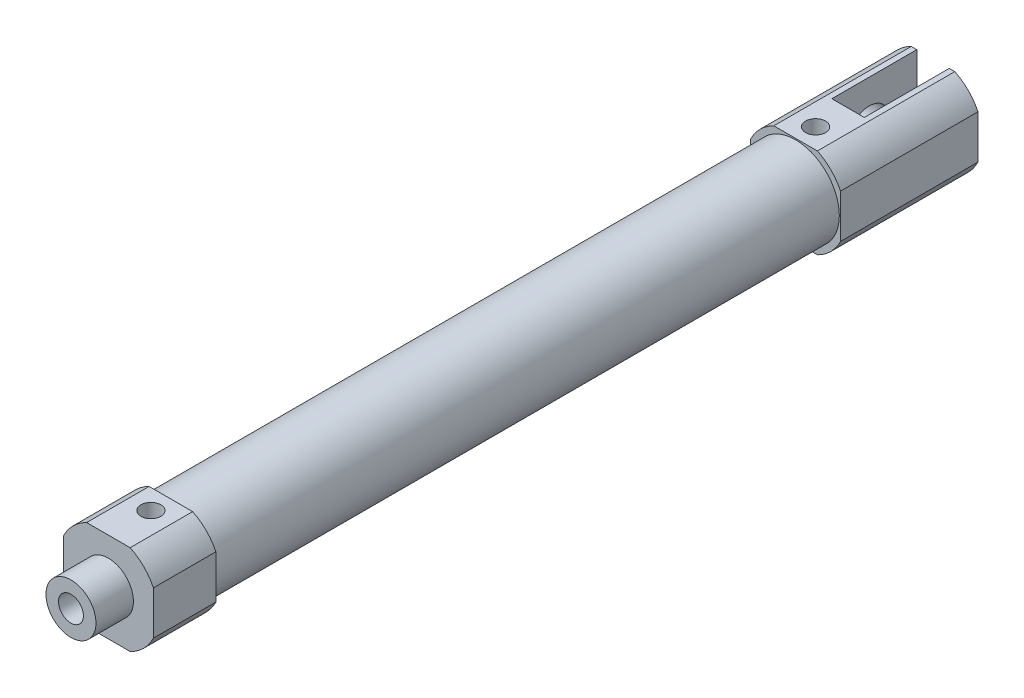
ISO-10303-21;
HEADER;
FILE_DESCRIPTION(('STEP AP214'),'2;1');
FILE_NAME('part.step','',(''),(''),'','','');
FILE_SCHEMA(('AUTOMOTIVE_DESIGN { 1 0 10303 214 1 1 1 1 }'));
ENDSEC;
DATA;
#1=APPLICATION_CONTEXT('core data for automotive mechanical design processes');
#2=APPLICATION_PROTOCOL_DEFINITION('international standard','automotive_design',2000,#1);
#3=PRODUCT_CONTEXT('',#1,'mechanical');
#4=PRODUCT('Part','Part','',(#3));
#5=PRODUCT_RELATED_PRODUCT_CATEGORY('part','',(#4));
#6=PRODUCT_DEFINITION_FORMATION('','',#4);
#7=PRODUCT_DEFINITION_CONTEXT('part definition',#1,'design');
#8=PRODUCT_DEFINITION('design','',#6,#7);
#9=PRODUCT_DEFINITION_SHAPE('','',#8);
#10=(LENGTH_UNIT() NAMED_UNIT(*) SI_UNIT(.MILLI.,.METRE.));
#11=(NAMED_UNIT(*) PLANE_ANGLE_UNIT() SI_UNIT($,.RADIAN.));
#12=(NAMED_UNIT(*) SI_UNIT($,.STERADIAN.) SOLID_ANGLE_UNIT());
#13=UNCERTAINTY_MEASURE_WITH_UNIT(LENGTH_MEASURE(1.E-05),#10,'distance_accuracy_value','');
#14=(GEOMETRIC_REPRESENTATION_CONTEXT(3) GLOBAL_UNCERTAINTY_ASSIGNED_CONTEXT((#13)) GLOBAL_UNIT_ASSIGNED_CONTEXT((#10,
#11,#12)) REPRESENTATION_CONTEXT('',''));
#15=CARTESIAN_POINT('',(0.,0.,0.));
#16=DIRECTION('',(0.,0.,1.));
#17=DIRECTION('',(1.,0.,0.));
#18=AXIS2_PLACEMENT_3D('',#15,#16,#17);
#19=CARTESIAN_POINT('',(0.,0.,-152.5));
#20=DIRECTION('',(0.,0.,-1.));
#21=DIRECTION('',(-1.,0.,0.));
#22=AXIS2_PLACEMENT_3D('',#19,#20,#21);
#23=PLANE('',#22);
#24=DIRECTION('',(0.,1.,0.));
#25=VECTOR('',#24,1.);
#26=CARTESIAN_POINT('',(-3.25,-9.,-152.5));
#27=LINE('',#26,#25);
#28=CARTESIAN_POINT('',(-3.25,-9.,-152.5));
#29=VERTEX_POINT('',#28);
#30=CARTESIAN_POINT('',(-3.25,9.,-152.5));
#31=VERTEX_POINT('',#30);
#32=EDGE_CURVE('E289',#29,#31,#27,.T.);
#33=ORIENTED_EDGE('',*,*,#32,.F.);
#34=DIRECTION('',(-1.,0.,0.));
#35=VECTOR('',#34,1.);
#36=CARTESIAN_POINT('',(4.35889894354067,-9.,-152.5));
#37=LINE('',#36,#35);
#38=CARTESIAN_POINT('',(-4.35889894354067,-9.,-152.5));
#39=VERTEX_POINT('',#38);
#40=EDGE_CURVE('E254',#29,#39,#37,.T.);
#41=ORIENTED_EDGE('',*,*,#40,.T.);
#42=CARTESIAN_POINT('',(0.,0.,-152.5));
#43=DIRECTION('',(0.,0.,-1.));
#44=DIRECTION('',(-1.,0.,0.));
#45=AXIS2_PLACEMENT_3D('',#42,#43,#44);
#46=CIRCLE('',#45,10.);
#47=CARTESIAN_POINT('',(-9.,-4.35889894354067,-152.5));
#48=VERTEX_POINT('',#47);
#49=EDGE_CURVE('E229',#39,#48,#46,.T.);
#50=ORIENTED_EDGE('',*,*,#49,.T.);
#51=DIRECTION('',(0.,1.,0.));
#52=VECTOR('',#51,1.);
#53=CARTESIAN_POINT('',(-9.,-4.35889894354067,-152.5));
#54=LINE('',#53,#52);
#55=CARTESIAN_POINT('',(-9.,4.35889894354067,-152.5));
#56=VERTEX_POINT('',#55);
#57=EDGE_CURVE('E271',#48,#56,#54,.T.);
#58=ORIENTED_EDGE('',*,*,#57,.T.);
#59=CARTESIAN_POINT('',(0.,0.,-152.5));
#60=DIRECTION('',(0.,0.,-1.));
#61=DIRECTION('',(-1.,0.,0.));
#62=AXIS2_PLACEMENT_3D('',#59,#60,#61);
#63=CIRCLE('',#62,10.);
#64=CARTESIAN_POINT('',(-4.35889894354068,9.,-152.5));
#65=VERTEX_POINT('',#64);
#66=EDGE_CURVE('E268',#56,#65,#63,.T.);
#67=ORIENTED_EDGE('',*,*,#66,.T.);
#68=DIRECTION('',(1.,0.,0.));
#69=VECTOR('',#68,1.);
#70=CARTESIAN_POINT('',(4.35889894354067,9.,-152.5));
#71=LINE('',#70,#69);
#72=EDGE_CURVE('E264',#65,#31,#71,.T.);
#73=ORIENTED_EDGE('',*,*,#72,.T.);
#74=EDGE_LOOP('',(#33,#41,#50,#58,#67,#73));
#75=FACE_BOUND('',#74,.T.);
#76=ADVANCED_FACE('F36',(#75),#23,.T.);
#77=CARTESIAN_POINT('',(0.,-22.1414213562373,0.));
#78=DIRECTION('',(0.,0.,1.));
#79=DIRECTION('',(1.,0.,0.));
#80=AXIS2_PLACEMENT_3D('',#77,#78,#79);
#81=PLANE('',#80);
#82=DIRECTION('',(0.,1.,0.));
#83=VECTOR('',#82,1.);
#84=CARTESIAN_POINT('',(9.00000000000001,-22.1414213562373,0.));
#85=LINE('',#84,#83);
#86=CARTESIAN_POINT('',(9.,-4.35889894354067,0.));
#87=VERTEX_POINT('',#86);
#88=CARTESIAN_POINT('',(9.,4.35889894354068,0.));
#89=VERTEX_POINT('',#88);
#90=EDGE_CURVE('E148',#87,#89,#85,.T.);
#91=ORIENTED_EDGE('',*,*,#90,.F.);
#92=CARTESIAN_POINT('',(0.,0.,0.));
#93=DIRECTION('',(0.,0.,1.));
#94=DIRECTION('',(1.,0.,0.));
#95=AXIS2_PLACEMENT_3D('',#92,#93,#94);
#96=CIRCLE('',#95,10.);
#97=CARTESIAN_POINT('',(4.35889894354068,-9.,0.));
#98=VERTEX_POINT('',#97);
#99=EDGE_CURVE('E94',#98,#87,#96,.T.);
#100=ORIENTED_EDGE('',*,*,#99,.F.);
#101=DIRECTION('',(1.,0.,0.));
#102=VECTOR('',#101,1.);
#103=CARTESIAN_POINT('',(0.,-9.,0.));
#104=LINE('',#103,#102);
#105=CARTESIAN_POINT('',(-4.35889894354068,-9.,0.));
#106=VERTEX_POINT('',#105);
#107=EDGE_CURVE('E162',#106,#98,#104,.T.);
#108=ORIENTED_EDGE('',*,*,#107,.F.);
#109=CARTESIAN_POINT('',(-9.,-4.35889894354068,0.));
#110=VERTEX_POINT('',#109);
#111=EDGE_CURVE('E136',#110,#106,#96,.T.);
#112=ORIENTED_EDGE('',*,*,#111,.F.);
#113=DIRECTION('',(0.,1.,0.));
#114=VECTOR('',#113,1.);
#115=CARTESIAN_POINT('',(-8.99999999999999,-22.1414213562373,0.));
#116=LINE('',#115,#114);
#117=CARTESIAN_POINT('',(-9.,4.35889894354067,0.));
#118=VERTEX_POINT('',#117);
#119=EDGE_CURVE('E159',#110,#118,#116,.T.);
#120=ORIENTED_EDGE('',*,*,#119,.T.);
#121=CARTESIAN_POINT('',(-4.35889894354067,9.,0.));
#122=VERTEX_POINT('',#121);
#123=EDGE_CURVE('E156',#122,#118,#96,.T.);
#124=ORIENTED_EDGE('',*,*,#123,.F.);
#125=DIRECTION('',(1.,0.,0.));
#126=VECTOR('',#125,1.);
#127=CARTESIAN_POINT('',(0.,8.99999999999999,0.));
#128=LINE('',#127,#126);
#129=CARTESIAN_POINT('',(4.35889894354068,8.99999999999999,0.));
#130=VERTEX_POINT('',#129);
#131=EDGE_CURVE('E155',#122,#130,#128,.T.);
#132=ORIENTED_EDGE('',*,*,#131,.T.);
#133=EDGE_CURVE('E151',#89,#130,#96,.T.);
#134=ORIENTED_EDGE('',*,*,#133,.F.);
#135=EDGE_LOOP('',(#91,#100,#108,#112,#120,#124,#132,#134));
#136=FACE_BOUND('',#135,.T.);
#137=CARTESIAN_POINT('',(0.,0.,0.));
#138=DIRECTION('',(0.,0.,1.));
#139=DIRECTION('',(1.,0.,0.));
#140=AXIS2_PLACEMENT_3D('',#137,#138,#139);
#141=CIRCLE('',#140,8.75);
#142=CARTESIAN_POINT('',(8.75,0.,0.));
#143=VERTEX_POINT('',#142);
#144=EDGE_CURVE('E11',#143,#143,#141,.F.);
#145=ORIENTED_EDGE('',*,*,#144,.F.);
#146=EDGE_LOOP('',(#145));
#147=FACE_BOUND('',#146,.T.);
#148=ADVANCED_FACE('F179',(#136,#147),#81,.F.);
#149=CARTESIAN_POINT('',(0.,-22.1414213562373,12.5));
#150=DIRECTION('',(0.,0.,1.));
#151=DIRECTION('',(1.,0.,0.));
#152=AXIS2_PLACEMENT_3D('',#149,#150,#151);
#153=PLANE('',#152);
#154=DIRECTION('',(0.,1.,0.));
#155=VECTOR('',#154,1.);
#156=CARTESIAN_POINT('',(9.00000000000001,-22.1414213562373,12.5));
#157=LINE('',#156,#155);
#158=CARTESIAN_POINT('',(9.,-4.35889894354067,12.5));
#159=VERTEX_POINT('',#158);
#160=CARTESIAN_POINT('',(9.,4.35889894354068,12.5));
#161=VERTEX_POINT('',#160);
#162=EDGE_CURVE('E190',#159,#161,#157,.T.);
#163=ORIENTED_EDGE('',*,*,#162,.T.);
#164=CARTESIAN_POINT('',(0.,0.,12.5));
#165=DIRECTION('',(0.,0.,1.));
#166=DIRECTION('',(1.,0.,0.));
#167=AXIS2_PLACEMENT_3D('',#164,#165,#166);
#168=CIRCLE('',#167,10.);
#169=CARTESIAN_POINT('',(4.35889894354068,8.99999999999999,12.5));
#170=VERTEX_POINT('',#169);
#171=EDGE_CURVE('E103',#161,#170,#168,.T.);
#172=ORIENTED_EDGE('',*,*,#171,.T.);
#173=DIRECTION('',(1.,0.,0.));
#174=VECTOR('',#173,1.);
#175=CARTESIAN_POINT('',(0.,8.99999999999999,12.5));
#176=LINE('',#175,#174);
#177=CARTESIAN_POINT('',(-4.35889894354067,9.,12.5));
#178=VERTEX_POINT('',#177);
#179=EDGE_CURVE('E189',#178,#170,#176,.T.);
#180=ORIENTED_EDGE('',*,*,#179,.F.);
#181=CARTESIAN_POINT('',(-9.,4.35889894354067,12.5));
#182=VERTEX_POINT('',#181);
#183=EDGE_CURVE('E131',#178,#182,#168,.T.);
#184=ORIENTED_EDGE('',*,*,#183,.T.);
#185=DIRECTION('',(0.,1.,0.));
#186=VECTOR('',#185,1.);
#187=CARTESIAN_POINT('',(-8.99999999999999,-22.1414213562373,12.5));
#188=LINE('',#187,#186);
#189=CARTESIAN_POINT('',(-9.,-4.35889894354068,12.5));
#190=VERTEX_POINT('',#189);
#191=EDGE_CURVE('E128',#190,#182,#188,.T.);
#192=ORIENTED_EDGE('',*,*,#191,.F.);
#193=CARTESIAN_POINT('',(-4.35889894354068,-9.,12.5));
#194=VERTEX_POINT('',#193);
#195=EDGE_CURVE('E120',#190,#194,#168,.T.);
#196=ORIENTED_EDGE('',*,*,#195,.T.);
#197=DIRECTION('',(1.,0.,0.));
#198=VECTOR('',#197,1.);
#199=CARTESIAN_POINT('',(0.,-9.,12.5));
#200=LINE('',#199,#198);
#201=CARTESIAN_POINT('',(4.35889894354068,-9.,12.5));
#202=VERTEX_POINT('',#201);
#203=EDGE_CURVE('E125',#194,#202,#200,.T.);
#204=ORIENTED_EDGE('',*,*,#203,.T.);
#205=EDGE_CURVE('E61',#202,#159,#168,.T.);
#206=ORIENTED_EDGE('',*,*,#205,.T.);
#207=EDGE_LOOP('',(#163,#172,#180,#184,#192,#196,#204,#206));
#208=FACE_BOUND('',#207,.T.);
#209=CARTESIAN_POINT('',(0.,0.,12.5));
#210=DIRECTION('',(0.,0.,1.));
#211=DIRECTION('',(1.,0.,0.));
#212=AXIS2_PLACEMENT_3D('',#209,#210,#211);
#213=CIRCLE('',#212,5.);
#214=CARTESIAN_POINT('',(5.,0.,12.5));
#215=VERTEX_POINT('',#214);
#216=EDGE_CURVE('E193',#215,#215,#213,.T.);
#217=ORIENTED_EDGE('',*,*,#216,.F.);
#218=EDGE_LOOP('',(#217));
#219=FACE_BOUND('',#218,.T.);
#220=ADVANCED_FACE('F122',(#208,#219),#153,.T.);
#221=CARTESIAN_POINT('',(9.00000000000001,-22.1414213562373,12.5));
#222=DIRECTION('',(-1.,0.,0.));
#223=DIRECTION('',(0.,-1.,0.));
#224=AXIS2_PLACEMENT_3D('',#221,#222,#223);
#225=PLANE('',#224);
#226=ORIENTED_EDGE('',*,*,#90,.T.);
#227=DIRECTION('',(0.,0.,-1.));
#228=VECTOR('',#227,1.);
#229=CARTESIAN_POINT('',(9.,4.35889894354068,12.5));
#230=LINE('',#229,#228);
#231=EDGE_CURVE('E45',#161,#89,#230,.T.);
#232=ORIENTED_EDGE('',*,*,#231,.F.);
#233=ORIENTED_EDGE('',*,*,#162,.F.);
#234=DIRECTION('',(0.,0.,-1.));
#235=VECTOR('',#234,1.);
#236=CARTESIAN_POINT('',(9.,-4.35889894354067,12.5));
#237=LINE('',#236,#235);
#238=EDGE_CURVE('E144',#159,#87,#237,.T.);
#239=ORIENTED_EDGE('',*,*,#238,.T.);
#240=EDGE_LOOP('',(#226,#232,#233,#239));
#241=FACE_BOUND('',#240,.T.);
#242=ADVANCED_FACE('F38',(#241),#225,.F.);
#243=CARTESIAN_POINT('',(0.,0.,12.5));
#244=DIRECTION('',(0.,0.,-1.));
#245=DIRECTION('',(-1.,0.,0.));
#246=AXIS2_PLACEMENT_3D('',#243,#244,#245);
#247=CYLINDRICAL_SURFACE('',#246,10.);
#248=ORIENTED_EDGE('',*,*,#133,.T.);
#249=DIRECTION('',(0.,0.,-1.));
#250=VECTOR('',#249,1.);
#251=CARTESIAN_POINT('',(4.35889894354068,8.99999999999999,12.5));
#252=LINE('',#251,#250);
#253=EDGE_CURVE('E171',#170,#130,#252,.T.);
#254=ORIENTED_EDGE('',*,*,#253,.F.);
#255=ORIENTED_EDGE('',*,*,#171,.F.);
#256=ORIENTED_EDGE('',*,*,#231,.T.);
#257=EDGE_LOOP('',(#248,#254,#255,#256));
#258=FACE_BOUND('',#257,.T.);
#259=ADVANCED_FACE('F174',(#258),#247,.T.);
#260=CARTESIAN_POINT('',(0.,8.99999999999999,12.5));
#261=DIRECTION('',(0.,1.,0.));
#262=DIRECTION('',(-1.,0.,0.));
#263=AXIS2_PLACEMENT_3D('',#260,#261,#262);
#264=PLANE('',#263);
#265=CARTESIAN_POINT('',(0.,8.99999999999999,4.));
#266=DIRECTION('',(0.,1.,0.));
#267=DIRECTION('',(-1.,0.,0.));
#268=AXIS2_PLACEMENT_3D('',#265,#266,#267);
#269=CIRCLE('',#268,2.);
#270=CARTESIAN_POINT('',(-2.,8.99999999999999,4.));
#271=VERTEX_POINT('',#270);
#272=EDGE_CURVE('E318',#271,#271,#269,.T.);
#273=ORIENTED_EDGE('',*,*,#272,.F.);
#274=EDGE_LOOP('',(#273));
#275=FACE_BOUND('',#274,.T.);
#276=ORIENTED_EDGE('',*,*,#131,.F.);
#277=DIRECTION('',(0.,0.,-1.));
#278=VECTOR('',#277,1.);
#279=CARTESIAN_POINT('',(-4.35889894354067,9.,12.5));
#280=LINE('',#279,#278);
#281=EDGE_CURVE('E169',#178,#122,#280,.T.);
#282=ORIENTED_EDGE('',*,*,#281,.F.);
#283=ORIENTED_EDGE('',*,*,#179,.T.);
#284=ORIENTED_EDGE('',*,*,#253,.T.);
#285=EDGE_LOOP('',(#276,#282,#283,#284));
#286=FACE_BOUND('',#285,.T.);
#287=ADVANCED_FACE('F185',(#275,#286),#264,.T.);
#288=ORIENTED_EDGE('',*,*,#123,.T.);
#289=DIRECTION('',(0.,0.,-1.));
#290=VECTOR('',#289,1.);
#291=CARTESIAN_POINT('',(-9.,4.35889894354067,12.5));
#292=LINE('',#291,#290);
#293=EDGE_CURVE('E167',#182,#118,#292,.T.);
#294=ORIENTED_EDGE('',*,*,#293,.F.);
#295=ORIENTED_EDGE('',*,*,#183,.F.);
#296=ORIENTED_EDGE('',*,*,#281,.T.);
#297=EDGE_LOOP('',(#288,#294,#295,#296));
#298=FACE_BOUND('',#297,.T.);
#299=ADVANCED_FACE('F689',(#298),#247,.T.);
#300=CARTESIAN_POINT('',(-8.99999999999999,-22.1414213562373,12.5));
#301=DIRECTION('',(-1.,0.,0.));
#302=DIRECTION('',(0.,-1.,0.));
#303=AXIS2_PLACEMENT_3D('',#300,#301,#302);
#304=PLANE('',#303);
#305=ORIENTED_EDGE('',*,*,#119,.F.);
#306=DIRECTION('',(0.,0.,-1.));
#307=VECTOR('',#306,1.);
#308=CARTESIAN_POINT('',(-9.,-4.35889894354068,12.5));
#309=LINE('',#308,#307);
#310=EDGE_CURVE('E139',#190,#110,#309,.T.);
#311=ORIENTED_EDGE('',*,*,#310,.F.);
#312=ORIENTED_EDGE('',*,*,#191,.T.);
#313=ORIENTED_EDGE('',*,*,#293,.T.);
#314=EDGE_LOOP('',(#305,#311,#312,#313));
#315=FACE_BOUND('',#314,.T.);
#316=ADVANCED_FACE('F688',(#315),#304,.T.);
#317=ORIENTED_EDGE('',*,*,#111,.T.);
#318=DIRECTION('',(0.,0.,-1.));
#319=VECTOR('',#318,1.);
#320=CARTESIAN_POINT('',(-4.35889894354068,-9.,12.5));
#321=LINE('',#320,#319);
#322=EDGE_CURVE('E133',#194,#106,#321,.T.);
#323=ORIENTED_EDGE('',*,*,#322,.F.);
#324=ORIENTED_EDGE('',*,*,#195,.F.);
#325=ORIENTED_EDGE('',*,*,#310,.T.);
#326=EDGE_LOOP('',(#317,#323,#324,#325));
#327=FACE_BOUND('',#326,.T.);
#328=ADVANCED_FACE('F134',(#327),#247,.T.);
#329=CARTESIAN_POINT('',(0.,-9.,12.5));
#330=DIRECTION('',(0.,1.,0.));
#331=DIRECTION('',(0.,0.,1.));
#332=AXIS2_PLACEMENT_3D('',#329,#330,#331);
#333=PLANE('',#332);
#334=ORIENTED_EDGE('',*,*,#107,.T.);
#335=DIRECTION('',(0.,0.,-1.));
#336=VECTOR('',#335,1.);
#337=CARTESIAN_POINT('',(4.35889894354068,-9.,12.5));
#338=LINE('',#337,#336);
#339=EDGE_CURVE('E140',#202,#98,#338,.T.);
#340=ORIENTED_EDGE('',*,*,#339,.F.);
#341=ORIENTED_EDGE('',*,*,#203,.F.);
#342=ORIENTED_EDGE('',*,*,#322,.T.);
#343=EDGE_LOOP('',(#334,#340,#341,#342));
#344=FACE_BOUND('',#343,.T.);
#345=ADVANCED_FACE('F142',(#344),#333,.F.);
#346=ORIENTED_EDGE('',*,*,#99,.T.);
#347=ORIENTED_EDGE('',*,*,#238,.F.);
#348=ORIENTED_EDGE('',*,*,#205,.F.);
#349=ORIENTED_EDGE('',*,*,#339,.T.);
#350=EDGE_LOOP('',(#346,#347,#348,#349));
#351=FACE_BOUND('',#350,.T.);
#352=ADVANCED_FACE('F349',(#351),#247,.T.);
#353=CARTESIAN_POINT('',(0.,0.,20.));
#354=DIRECTION('',(0.,0.,-1.));
#355=DIRECTION('',(-1.,0.,0.));
#356=AXIS2_PLACEMENT_3D('',#353,#354,#355);
#357=CYLINDRICAL_SURFACE('',#356,5.);
#358=CARTESIAN_POINT('',(0.,0.,20.));
#359=DIRECTION('',(0.,0.,1.));
#360=DIRECTION('',(1.,0.,0.));
#361=AXIS2_PLACEMENT_3D('',#358,#359,#360);
#362=CIRCLE('',#361,5.);
#363=CARTESIAN_POINT('',(5.,0.,20.));
#364=VERTEX_POINT('',#363);
#365=EDGE_CURVE('E152',#364,#364,#362,.T.);
#366=ORIENTED_EDGE('',*,*,#365,.F.);
#367=EDGE_LOOP('',(#366));
#368=FACE_BOUND('',#367,.T.);
#369=ORIENTED_EDGE('',*,*,#216,.T.);
#370=EDGE_LOOP('',(#369));
#371=FACE_BOUND('',#370,.T.);
#372=ADVANCED_FACE('F343',(#368,#371),#357,.T.);
#373=CARTESIAN_POINT('',(0.,0.,20.));
#374=DIRECTION('',(0.,0.,1.));
#375=DIRECTION('',(1.,0.,0.));
#376=AXIS2_PLACEMENT_3D('',#373,#374,#375);
#377=PLANE('',#376);
#378=CARTESIAN_POINT('',(0.,0.,20.));
#379=DIRECTION('',(0.,0.,1.));
#380=DIRECTION('',(1.,0.,0.));
#381=AXIS2_PLACEMENT_3D('',#378,#379,#380);
#382=CIRCLE('',#381,2.5);
#383=CARTESIAN_POINT('',(2.5,0.,20.));
#384=VERTEX_POINT('',#383);
#385=EDGE_CURVE('E324',#384,#384,#382,.T.);
#386=ORIENTED_EDGE('',*,*,#385,.F.);
#387=EDGE_LOOP('',(#386));
#388=FACE_BOUND('',#387,.T.);
#389=ORIENTED_EDGE('',*,*,#365,.T.);
#390=EDGE_LOOP('',(#389));
#391=FACE_BOUND('',#390,.T.);
#392=ADVANCED_FACE('F339',(#388,#391),#377,.T.);
#393=CARTESIAN_POINT('',(0.,0.,-125.));
#394=DIRECTION('',(0.,0.,1.));
#395=DIRECTION('',(1.,0.,0.));
#396=AXIS2_PLACEMENT_3D('',#393,#394,#395);
#397=CYLINDRICAL_SURFACE('',#396,8.75);
#398=CARTESIAN_POINT('',(0.,0.,-125.));
#399=DIRECTION('',(0.,0.,-1.));
#400=DIRECTION('',(-1.,0.,0.));
#401=AXIS2_PLACEMENT_3D('',#398,#399,#400);
#402=CIRCLE('',#401,8.75);
#403=CARTESIAN_POINT('',(-8.75,0.,-125.));
#404=VERTEX_POINT('',#403);
#405=EDGE_CURVE('E196',#404,#404,#402,.T.);
#406=ORIENTED_EDGE('',*,*,#405,.F.);
#407=EDGE_LOOP('',(#406));
#408=FACE_BOUND('',#407,.T.);
#409=ORIENTED_EDGE('',*,*,#144,.T.);
#410=EDGE_LOOP('',(#409));
#411=FACE_BOUND('',#410,.T.);
#412=ADVANCED_FACE('F342',(#408,#411),#397,.T.);
#413=CARTESIAN_POINT('',(0.,0.,-125.));
#414=DIRECTION('',(0.,0.,-1.));
#415=DIRECTION('',(-1.,0.,0.));
#416=AXIS2_PLACEMENT_3D('',#413,#414,#415);
#417=PLANE('',#416);
#418=CARTESIAN_POINT('',(0.,0.,-125.));
#419=DIRECTION('',(0.,0.,-1.));
#420=DIRECTION('',(-1.,0.,0.));
#421=AXIS2_PLACEMENT_3D('',#418,#419,#420);
#422=CIRCLE('',#421,10.);
#423=CARTESIAN_POINT('',(-4.35889894354067,-9.,-125.));
#424=VERTEX_POINT('',#423);
#425=CARTESIAN_POINT('',(-9.,-4.35889894354067,-125.));
#426=VERTEX_POINT('',#425);
#427=EDGE_CURVE('E248',#424,#426,#422,.T.);
#428=ORIENTED_EDGE('',*,*,#427,.F.);
#429=DIRECTION('',(-1.,0.,0.));
#430=VECTOR('',#429,1.);
#431=CARTESIAN_POINT('',(4.35889894354067,-9.,-125.));
#432=LINE('',#431,#430);
#433=CARTESIAN_POINT('',(4.35889894354067,-9.,-125.));
#434=VERTEX_POINT('',#433);
#435=EDGE_CURVE('E226',#434,#424,#432,.T.);
#436=ORIENTED_EDGE('',*,*,#435,.F.);
#437=CARTESIAN_POINT('',(0.,0.,-125.));
#438=DIRECTION('',(0.,0.,-1.));
#439=DIRECTION('',(-1.,0.,0.));
#440=AXIS2_PLACEMENT_3D('',#437,#438,#439);
#441=CIRCLE('',#440,10.);
#442=CARTESIAN_POINT('',(9.,-4.35889894354067,-125.));
#443=VERTEX_POINT('',#442);
#444=EDGE_CURVE('E230',#443,#434,#441,.T.);
#445=ORIENTED_EDGE('',*,*,#444,.F.);
#446=DIRECTION('',(0.,-1.,0.));
#447=VECTOR('',#446,1.);
#448=CARTESIAN_POINT('',(9.,-4.35889894354068,-125.));
#449=LINE('',#448,#447);
#450=CARTESIAN_POINT('',(9.,4.35889894354068,-125.));
#451=VERTEX_POINT('',#450);
#452=EDGE_CURVE('E233',#451,#443,#449,.T.);
#453=ORIENTED_EDGE('',*,*,#452,.F.);
#454=CARTESIAN_POINT('',(0.,0.,-125.));
#455=DIRECTION('',(0.,0.,-1.));
#456=DIRECTION('',(-1.,0.,0.));
#457=AXIS2_PLACEMENT_3D('',#454,#455,#456);
#458=CIRCLE('',#457,10.);
#459=CARTESIAN_POINT('',(4.35889894354068,9.,-125.));
#460=VERTEX_POINT('',#459);
#461=EDGE_CURVE('E236',#460,#451,#458,.T.);
#462=ORIENTED_EDGE('',*,*,#461,.F.);
#463=DIRECTION('',(1.,0.,0.));
#464=VECTOR('',#463,1.);
#465=CARTESIAN_POINT('',(4.35889894354067,9.,-125.));
#466=LINE('',#465,#464);
#467=CARTESIAN_POINT('',(-4.35889894354068,9.,-125.));
#468=VERTEX_POINT('',#467);
#469=EDGE_CURVE('E239',#468,#460,#466,.T.);
#470=ORIENTED_EDGE('',*,*,#469,.F.);
#471=CARTESIAN_POINT('',(0.,0.,-125.));
#472=DIRECTION('',(0.,0.,-1.));
#473=DIRECTION('',(-1.,0.,0.));
#474=AXIS2_PLACEMENT_3D('',#471,#472,#473);
#475=CIRCLE('',#474,10.);
#476=CARTESIAN_POINT('',(-9.,4.35889894354067,-125.));
#477=VERTEX_POINT('',#476);
#478=EDGE_CURVE('E242',#477,#468,#475,.T.);
#479=ORIENTED_EDGE('',*,*,#478,.F.);
#480=DIRECTION('',(0.,1.,0.));
#481=VECTOR('',#480,1.);
#482=CARTESIAN_POINT('',(-9.,-4.35889894354067,-125.));
#483=LINE('',#482,#481);
#484=EDGE_CURVE('E245',#426,#477,#483,.T.);
#485=ORIENTED_EDGE('',*,*,#484,.F.);
#486=EDGE_LOOP('',(#428,#436,#445,#453,#462,#470,#479,#485));
#487=FACE_BOUND('',#486,.T.);
#488=ORIENTED_EDGE('',*,*,#405,.T.);
#489=EDGE_LOOP('',(#488));
#490=FACE_BOUND('',#489,.T.);
#491=ADVANCED_FACE('F468',(#487,#490),#417,.F.);
#492=CARTESIAN_POINT('',(0.,0.,-152.5));
#493=DIRECTION('',(0.,0.,1.));
#494=DIRECTION('',(1.,0.,0.));
#495=AXIS2_PLACEMENT_3D('',#492,#493,#494);
#496=CYLINDRICAL_SURFACE('',#495,10.);
#497=ORIENTED_EDGE('',*,*,#427,.T.);
#498=DIRECTION('',(0.,0.,1.));
#499=VECTOR('',#498,1.);
#500=CARTESIAN_POINT('',(-9.,-4.35889894354067,-152.5));
#501=LINE('',#500,#499);
#502=EDGE_CURVE('E201',#48,#426,#501,.T.);
#503=ORIENTED_EDGE('',*,*,#502,.F.);
#504=ORIENTED_EDGE('',*,*,#49,.F.);
#505=DIRECTION('',(0.,0.,1.));
#506=VECTOR('',#505,1.);
#507=CARTESIAN_POINT('',(-4.35889894354067,-9.,-152.5));
#508=LINE('',#507,#506);
#509=EDGE_CURVE('E222',#39,#424,#508,.T.);
#510=ORIENTED_EDGE('',*,*,#509,.T.);
#511=EDGE_LOOP('',(#497,#503,#504,#510));
#512=FACE_BOUND('',#511,.T.);
#513=ADVANCED_FACE('F465',(#512),#496,.T.);
#514=CARTESIAN_POINT('',(-9.,-4.35889894354067,-152.5));
#515=DIRECTION('',(1.,0.,0.));
#516=DIRECTION('',(0.,0.,-1.));
#517=AXIS2_PLACEMENT_3D('',#514,#515,#516);
#518=PLANE('',#517);
#519=CARTESIAN_POINT('',(-9.,0.,-143.));
#520=DIRECTION('',(-1.,0.,0.));
#521=DIRECTION('',(0.,0.,1.));
#522=AXIS2_PLACEMENT_3D('',#519,#520,#521);
#523=CIRCLE('',#522,3.99999999999999);
#524=CARTESIAN_POINT('',(-9.,0.,-139.));
#525=VERTEX_POINT('',#524);
#526=EDGE_CURVE('E305',#525,#525,#523,.T.);
#527=ORIENTED_EDGE('',*,*,#526,.F.);
#528=EDGE_LOOP('',(#527));
#529=FACE_BOUND('',#528,.T.);
#530=ORIENTED_EDGE('',*,*,#484,.T.);
#531=DIRECTION('',(0.,0.,1.));
#532=VECTOR('',#531,1.);
#533=CARTESIAN_POINT('',(-9.,4.35889894354067,-152.5));
#534=LINE('',#533,#532);
#535=EDGE_CURVE('E204',#56,#477,#534,.T.);
#536=ORIENTED_EDGE('',*,*,#535,.F.);
#537=ORIENTED_EDGE('',*,*,#57,.F.);
#538=ORIENTED_EDGE('',*,*,#502,.T.);
#539=EDGE_LOOP('',(#530,#536,#537,#538));
#540=FACE_BOUND('',#539,.T.);
#541=ADVANCED_FACE('F466',(#529,#540),#518,.F.);
#542=CARTESIAN_POINT('',(0.,0.,-152.5));
#543=DIRECTION('',(0.,0.,1.));
#544=DIRECTION('',(1.,0.,0.));
#545=AXIS2_PLACEMENT_3D('',#542,#543,#544);
#546=CYLINDRICAL_SURFACE('',#545,10.);
#547=ORIENTED_EDGE('',*,*,#478,.T.);
#548=DIRECTION('',(0.,0.,1.));
#549=VECTOR('',#548,1.);
#550=CARTESIAN_POINT('',(-4.35889894354068,9.,-152.5));
#551=LINE('',#550,#549);
#552=EDGE_CURVE('E207',#65,#468,#551,.T.);
#553=ORIENTED_EDGE('',*,*,#552,.F.);
#554=ORIENTED_EDGE('',*,*,#66,.F.);
#555=ORIENTED_EDGE('',*,*,#535,.T.);
#556=EDGE_LOOP('',(#547,#553,#554,#555));
#557=FACE_BOUND('',#556,.T.);
#558=ADVANCED_FACE('F446',(#557),#546,.T.);
#559=CARTESIAN_POINT('',(4.35889894354067,9.,-152.5));
#560=DIRECTION('',(0.,-1.,0.));
#561=DIRECTION('',(0.,0.,-1.));
#562=AXIS2_PLACEMENT_3D('',#559,#560,#561);
#563=PLANE('',#562);
#564=CARTESIAN_POINT('',(0.,9.,-129.));
#565=DIRECTION('',(0.,1.,0.));
#566=DIRECTION('',(0.,0.,1.));
#567=AXIS2_PLACEMENT_3D('',#564,#565,#566);
#568=CIRCLE('',#567,2.);
#569=CARTESIAN_POINT('',(0.,9.,-127.));
#570=VERTEX_POINT('',#569);
#571=EDGE_CURVE('E312',#570,#570,#568,.T.);
#572=ORIENTED_EDGE('',*,*,#571,.F.);
#573=EDGE_LOOP('',(#572));
#574=FACE_BOUND('',#573,.T.);
#575=DIRECTION('',(1.,0.,0.));
#576=VECTOR('',#575,1.);
#577=CARTESIAN_POINT('',(3.25,9.,-135.5));
#578=LINE('',#577,#576);
#579=CARTESIAN_POINT('',(-3.25,9.,-135.5));
#580=VERTEX_POINT('',#579);
#581=CARTESIAN_POINT('',(3.25,9.,-135.5));
#582=VERTEX_POINT('',#581);
#583=EDGE_CURVE('E298',#580,#582,#578,.T.);
#584=ORIENTED_EDGE('',*,*,#583,.F.);
#585=DIRECTION('',(0.,0.,-1.));
#586=VECTOR('',#585,1.);
#587=CARTESIAN_POINT('',(-3.25,9.,-135.5));
#588=LINE('',#587,#586);
#589=EDGE_CURVE('E276',#580,#31,#588,.T.);
#590=ORIENTED_EDGE('',*,*,#589,.T.);
#591=ORIENTED_EDGE('',*,*,#72,.F.);
#592=ORIENTED_EDGE('',*,*,#552,.T.);
#593=ORIENTED_EDGE('',*,*,#469,.T.);
#594=DIRECTION('',(0.,0.,1.));
#595=VECTOR('',#594,1.);
#596=CARTESIAN_POINT('',(4.35889894354068,9.,-152.5));
#597=LINE('',#596,#595);
#598=CARTESIAN_POINT('',(4.35889894354068,9.,-152.5));
#599=VERTEX_POINT('',#598);
#600=EDGE_CURVE('E210',#599,#460,#597,.T.);
#601=ORIENTED_EDGE('',*,*,#600,.F.);
#602=CARTESIAN_POINT('',(3.25,9.,-152.5));
#603=VERTEX_POINT('',#602);
#604=EDGE_CURVE('E267',#603,#599,#71,.T.);
#605=ORIENTED_EDGE('',*,*,#604,.F.);
#606=DIRECTION('',(0.,0.,-1.));
#607=VECTOR('',#606,1.);
#608=CARTESIAN_POINT('',(3.25,9.,-135.5));
#609=LINE('',#608,#607);
#610=EDGE_CURVE('E52',#582,#603,#609,.T.);
#611=ORIENTED_EDGE('',*,*,#610,.F.);
#612=EDGE_LOOP('',(#584,#590,#591,#592,#593,#601,#605,#611));
#613=FACE_BOUND('',#612,.T.);
#614=ADVANCED_FACE('F390',(#574,#613),#563,.F.);
#615=CARTESIAN_POINT('',(0.,0.,-152.5));
#616=DIRECTION('',(0.,0.,1.));
#617=DIRECTION('',(1.,0.,0.));
#618=AXIS2_PLACEMENT_3D('',#615,#616,#617);
#619=CYLINDRICAL_SURFACE('',#618,10.);
#620=ORIENTED_EDGE('',*,*,#461,.T.);
#621=DIRECTION('',(0.,0.,1.));
#622=VECTOR('',#621,1.);
#623=CARTESIAN_POINT('',(9.,4.35889894354068,-152.5));
#624=LINE('',#623,#622);
#625=CARTESIAN_POINT('',(9.,4.35889894354068,-152.5));
#626=VERTEX_POINT('',#625);
#627=EDGE_CURVE('E213',#626,#451,#624,.T.);
#628=ORIENTED_EDGE('',*,*,#627,.F.);
#629=CARTESIAN_POINT('',(0.,0.,-152.5));
#630=DIRECTION('',(0.,0.,-1.));
#631=DIRECTION('',(-1.,0.,0.));
#632=AXIS2_PLACEMENT_3D('',#629,#630,#631);
#633=CIRCLE('',#632,10.);
#634=EDGE_CURVE('E261',#599,#626,#633,.T.);
#635=ORIENTED_EDGE('',*,*,#634,.F.);
#636=ORIENTED_EDGE('',*,*,#600,.T.);
#637=EDGE_LOOP('',(#620,#628,#635,#636));
#638=FACE_BOUND('',#637,.T.);
#639=ADVANCED_FACE('F401',(#638),#619,.T.);
#640=CARTESIAN_POINT('',(9.,-4.35889894354068,-152.5));
#641=DIRECTION('',(-1.,0.,0.));
#642=DIRECTION('',(0.,0.,1.));
#643=AXIS2_PLACEMENT_3D('',#640,#641,#642);
#644=PLANE('',#643);
#645=ORIENTED_EDGE('',*,*,#452,.T.);
#646=DIRECTION('',(0.,0.,1.));
#647=VECTOR('',#646,1.);
#648=CARTESIAN_POINT('',(9.,-4.35889894354067,-152.5));
#649=LINE('',#648,#647);
#650=CARTESIAN_POINT('',(9.,-4.35889894354067,-152.5));
#651=VERTEX_POINT('',#650);
#652=EDGE_CURVE('E216',#651,#443,#649,.T.);
#653=ORIENTED_EDGE('',*,*,#652,.F.);
#654=DIRECTION('',(0.,-1.,0.));
#655=VECTOR('',#654,1.);
#656=CARTESIAN_POINT('',(9.,-4.35889894354068,-152.5));
#657=LINE('',#656,#655);
#658=EDGE_CURVE('E258',#626,#651,#657,.T.);
#659=ORIENTED_EDGE('',*,*,#658,.F.);
#660=ORIENTED_EDGE('',*,*,#627,.T.);
#661=EDGE_LOOP('',(#645,#653,#659,#660));
#662=FACE_BOUND('',#661,.T.);
#663=ADVANCED_FACE('F472',(#662),#644,.F.);
#664=CARTESIAN_POINT('',(0.,0.,-152.5));
#665=DIRECTION('',(0.,0.,1.));
#666=DIRECTION('',(1.,0.,0.));
#667=AXIS2_PLACEMENT_3D('',#664,#665,#666);
#668=CYLINDRICAL_SURFACE('',#667,10.);
#669=ORIENTED_EDGE('',*,*,#444,.T.);
#670=DIRECTION('',(0.,0.,1.));
#671=VECTOR('',#670,1.);
#672=CARTESIAN_POINT('',(4.35889894354067,-9.,-152.5));
#673=LINE('',#672,#671);
#674=CARTESIAN_POINT('',(4.35889894354067,-9.,-152.5));
#675=VERTEX_POINT('',#674);
#676=EDGE_CURVE('E219',#675,#434,#673,.T.);
#677=ORIENTED_EDGE('',*,*,#676,.F.);
#678=CARTESIAN_POINT('',(0.,0.,-152.5));
#679=DIRECTION('',(0.,0.,-1.));
#680=DIRECTION('',(-1.,0.,0.));
#681=AXIS2_PLACEMENT_3D('',#678,#679,#680);
#682=CIRCLE('',#681,10.);
#683=EDGE_CURVE('E255',#651,#675,#682,.T.);
#684=ORIENTED_EDGE('',*,*,#683,.F.);
#685=ORIENTED_EDGE('',*,*,#652,.T.);
#686=EDGE_LOOP('',(#669,#677,#684,#685));
#687=FACE_BOUND('',#686,.T.);
#688=ADVANCED_FACE('F378',(#687),#668,.T.);
#689=CARTESIAN_POINT('',(4.35889894354067,-9.,-152.5));
#690=DIRECTION('',(0.,1.,0.));
#691=DIRECTION('',(0.,0.,1.));
#692=AXIS2_PLACEMENT_3D('',#689,#690,#691);
#693=PLANE('',#692);
#694=ORIENTED_EDGE('',*,*,#40,.F.);
#695=DIRECTION('',(0.,0.,-1.));
#696=VECTOR('',#695,1.);
#697=CARTESIAN_POINT('',(-3.25,-9.,-135.5));
#698=LINE('',#697,#696);
#699=CARTESIAN_POINT('',(-3.25,-9.,-135.5));
#700=VERTEX_POINT('',#699);
#701=EDGE_CURVE('E251',#700,#29,#698,.T.);
#702=ORIENTED_EDGE('',*,*,#701,.F.);
#703=DIRECTION('',(-1.,0.,0.));
#704=VECTOR('',#703,1.);
#705=CARTESIAN_POINT('',(3.25,-9.,-135.5));
#706=LINE('',#705,#704);
#707=CARTESIAN_POINT('',(3.25,-9.,-135.5));
#708=VERTEX_POINT('',#707);
#709=EDGE_CURVE('E279',#708,#700,#706,.T.);
#710=ORIENTED_EDGE('',*,*,#709,.F.);
#711=DIRECTION('',(0.,0.,-1.));
#712=VECTOR('',#711,1.);
#713=CARTESIAN_POINT('',(3.25,-9.,-135.5));
#714=LINE('',#713,#712);
#715=CARTESIAN_POINT('',(3.25,-9.,-152.5));
#716=VERTEX_POINT('',#715);
#717=EDGE_CURVE('E281',#708,#716,#714,.T.);
#718=ORIENTED_EDGE('',*,*,#717,.T.);
#719=EDGE_CURVE('E225',#675,#716,#37,.T.);
#720=ORIENTED_EDGE('',*,*,#719,.F.);
#721=ORIENTED_EDGE('',*,*,#676,.T.);
#722=ORIENTED_EDGE('',*,*,#435,.T.);
#723=ORIENTED_EDGE('',*,*,#509,.F.);
#724=EDGE_LOOP('',(#694,#702,#710,#718,#720,#721,#722,#723));
#725=FACE_BOUND('',#724,.T.);
#726=ADVANCED_FACE('F370',(#725),#693,.F.);
#727=DIRECTION('',(0.,-1.,0.));
#728=VECTOR('',#727,1.);
#729=CARTESIAN_POINT('',(3.25,-9.,-152.5));
#730=LINE('',#729,#728);
#731=EDGE_CURVE('E286',#603,#716,#730,.T.);
#732=ORIENTED_EDGE('',*,*,#731,.F.);
#733=ORIENTED_EDGE('',*,*,#604,.T.);
#734=ORIENTED_EDGE('',*,*,#634,.T.);
#735=ORIENTED_EDGE('',*,*,#658,.T.);
#736=ORIENTED_EDGE('',*,*,#683,.T.);
#737=ORIENTED_EDGE('',*,*,#719,.T.);
#738=EDGE_LOOP('',(#732,#733,#734,#735,#736,#737));
#739=FACE_BOUND('',#738,.T.);
#740=ADVANCED_FACE('F362',(#739),#23,.T.);
#741=CARTESIAN_POINT('',(-3.25,-9.,-135.5));
#742=DIRECTION('',(-1.,0.,0.));
#743=DIRECTION('',(0.,0.,1.));
#744=AXIS2_PLACEMENT_3D('',#741,#742,#743);
#745=PLANE('',#744);
#746=CARTESIAN_POINT('',(-3.25,0.,-143.));
#747=DIRECTION('',(-1.,0.,0.));
#748=DIRECTION('',(0.,0.,1.));
#749=AXIS2_PLACEMENT_3D('',#746,#747,#748);
#750=CIRCLE('',#749,3.99999999999999);
#751=CARTESIAN_POINT('',(-3.25,0.,-139.));
#752=VERTEX_POINT('',#751);
#753=EDGE_CURVE('E292',#752,#752,#750,.T.);
#754=ORIENTED_EDGE('',*,*,#753,.T.);
#755=EDGE_LOOP('',(#754));
#756=FACE_BOUND('',#755,.T.);
#757=ORIENTED_EDGE('',*,*,#32,.T.);
#758=ORIENTED_EDGE('',*,*,#589,.F.);
#759=DIRECTION('',(0.,1.,0.));
#760=VECTOR('',#759,1.);
#761=CARTESIAN_POINT('',(-3.25,-9.,-135.5));
#762=LINE('',#761,#760);
#763=EDGE_CURVE('E288',#700,#580,#762,.T.);
#764=ORIENTED_EDGE('',*,*,#763,.F.);
#765=ORIENTED_EDGE('',*,*,#701,.T.);
#766=EDGE_LOOP('',(#757,#758,#764,#765));
#767=FACE_BOUND('',#766,.T.);
#768=ADVANCED_FACE('F369',(#756,#767),#745,.F.);
#769=CARTESIAN_POINT('',(3.25,-9.,-135.5));
#770=DIRECTION('',(1.,0.,0.));
#771=DIRECTION('',(0.,0.,-1.));
#772=AXIS2_PLACEMENT_3D('',#769,#770,#771);
#773=PLANE('',#772);
#774=CARTESIAN_POINT('',(3.25,0.,-143.));
#775=DIRECTION('',(1.,0.,0.));
#776=DIRECTION('',(0.,0.,-1.));
#777=AXIS2_PLACEMENT_3D('',#774,#775,#776);
#778=CIRCLE('',#777,3.99999999999999);
#779=CARTESIAN_POINT('',(3.25,0.,-147.));
#780=VERTEX_POINT('',#779);
#781=EDGE_CURVE('E40',#780,#780,#778,.T.);
#782=ORIENTED_EDGE('',*,*,#781,.T.);
#783=EDGE_LOOP('',(#782));
#784=FACE_BOUND('',#783,.T.);
#785=ORIENTED_EDGE('',*,*,#731,.T.);
#786=ORIENTED_EDGE('',*,*,#717,.F.);
#787=DIRECTION('',(0.,-1.,0.));
#788=VECTOR('',#787,1.);
#789=CARTESIAN_POINT('',(3.25,-9.,-135.5));
#790=LINE('',#789,#788);
#791=EDGE_CURVE('E295',#582,#708,#790,.T.);
#792=ORIENTED_EDGE('',*,*,#791,.F.);
#793=ORIENTED_EDGE('',*,*,#610,.T.);
#794=EDGE_LOOP('',(#785,#786,#792,#793));
#795=FACE_BOUND('',#794,.T.);
#796=ADVANCED_FACE('F376',(#784,#795),#773,.F.);
#797=CARTESIAN_POINT('',(-3.25,9.,-135.5));
#798=DIRECTION('',(0.,0.,1.));
#799=DIRECTION('',(1.,0.,0.));
#800=AXIS2_PLACEMENT_3D('',#797,#798,#799);
#801=PLANE('',#800);
#802=ORIENTED_EDGE('',*,*,#763,.T.);
#803=ORIENTED_EDGE('',*,*,#583,.T.);
#804=ORIENTED_EDGE('',*,*,#791,.T.);
#805=ORIENTED_EDGE('',*,*,#709,.T.);
#806=EDGE_LOOP('',(#802,#803,#804,#805));
#807=FACE_BOUND('',#806,.T.);
#808=ADVANCED_FACE('F455',(#807),#801,.F.);
#809=CARTESIAN_POINT('',(8.,0.,-143.));
#810=DIRECTION('',(-1.,0.,0.));
#811=DIRECTION('',(0.,0.,1.));
#812=AXIS2_PLACEMENT_3D('',#809,#810,#811);
#813=PLANE('',#812);
#814=CARTESIAN_POINT('',(8.,0.,-143.));
#815=DIRECTION('',(-1.,0.,0.));
#816=DIRECTION('',(0.,0.,1.));
#817=AXIS2_PLACEMENT_3D('',#814,#815,#816);
#818=CIRCLE('',#817,3.99999999999999);
#819=CARTESIAN_POINT('',(8.,0.,-139.));
#820=VERTEX_POINT('',#819);
#821=EDGE_CURVE('E308',#820,#820,#818,.T.);
#822=ORIENTED_EDGE('',*,*,#821,.T.);
#823=EDGE_LOOP('',(#822));
#824=FACE_BOUND('',#823,.T.);
#825=ADVANCED_FACE('F482',(#824),#813,.T.);
#826=CARTESIAN_POINT('',(8.,0.,-143.));
#827=DIRECTION('',(-1.,0.,0.));
#828=DIRECTION('',(0.,0.,1.));
#829=AXIS2_PLACEMENT_3D('',#826,#827,#828);
#830=CYLINDRICAL_SURFACE('',#829,3.99999999999999);
#831=ORIENTED_EDGE('',*,*,#821,.F.);
#832=EDGE_LOOP('',(#831));
#833=FACE_BOUND('',#832,.T.);
#834=ORIENTED_EDGE('',*,*,#781,.F.);
#835=EDGE_LOOP('',(#834));
#836=FACE_BOUND('',#835,.T.);
#837=ADVANCED_FACE('F490',(#833,#836),#830,.F.);
#838=ORIENTED_EDGE('',*,*,#526,.T.);
#839=EDGE_LOOP('',(#838));
#840=FACE_BOUND('',#839,.T.);
#841=ORIENTED_EDGE('',*,*,#753,.F.);
#842=EDGE_LOOP('',(#841));
#843=FACE_BOUND('',#842,.T.);
#844=ADVANCED_FACE('F486',(#840,#843),#830,.F.);
#845=CARTESIAN_POINT('',(0.,5.,-129.));
#846=DIRECTION('',(0.,1.,0.));
#847=DIRECTION('',(0.,0.,1.));
#848=AXIS2_PLACEMENT_3D('',#845,#846,#847);
#849=CYLINDRICAL_SURFACE('',#848,2.);
#850=CARTESIAN_POINT('',(0.,5.,-129.));
#851=DIRECTION('',(0.,1.,0.));
#852=DIRECTION('',(0.,0.,1.));
#853=AXIS2_PLACEMENT_3D('',#850,#851,#852);
#854=CIRCLE('',#853,2.);
#855=CARTESIAN_POINT('',(0.,5.,-127.));
#856=VERTEX_POINT('',#855);
#857=EDGE_CURVE('E309',#856,#856,#854,.T.);
#858=ORIENTED_EDGE('',*,*,#857,.F.);
#859=EDGE_LOOP('',(#858));
#860=FACE_BOUND('',#859,.T.);
#861=ORIENTED_EDGE('',*,*,#571,.T.);
#862=EDGE_LOOP('',(#861));
#863=FACE_BOUND('',#862,.T.);
#864=ADVANCED_FACE('F489',(#860,#863),#849,.F.);
#865=CARTESIAN_POINT('',(0.,5.,-129.));
#866=DIRECTION('',(0.,1.,0.));
#867=DIRECTION('',(0.,0.,1.));
#868=AXIS2_PLACEMENT_3D('',#865,#866,#867);
#869=PLANE('',#868);
#870=ORIENTED_EDGE('',*,*,#857,.T.);
#871=EDGE_LOOP('',(#870));
#872=FACE_BOUND('',#871,.T.);
#873=ADVANCED_FACE('F497',(#872),#869,.T.);
#874=CARTESIAN_POINT('',(0.,4.99999999999999,4.));
#875=DIRECTION('',(0.,1.,0.));
#876=DIRECTION('',(-1.,0.,0.));
#877=AXIS2_PLACEMENT_3D('',#874,#875,#876);
#878=CYLINDRICAL_SURFACE('',#877,2.);
#879=CARTESIAN_POINT('',(0.,4.99999999999999,4.));
#880=DIRECTION('',(0.,1.,0.));
#881=DIRECTION('',(-1.,0.,0.));
#882=AXIS2_PLACEMENT_3D('',#879,#880,#881);
#883=CIRCLE('',#882,2.);
#884=CARTESIAN_POINT('',(-2.,4.99999999999999,4.));
#885=VERTEX_POINT('',#884);
#886=EDGE_CURVE('E315',#885,#885,#883,.T.);
#887=ORIENTED_EDGE('',*,*,#886,.F.);
#888=EDGE_LOOP('',(#887));
#889=FACE_BOUND('',#888,.T.);
#890=ORIENTED_EDGE('',*,*,#272,.T.);
#891=EDGE_LOOP('',(#890));
#892=FACE_BOUND('',#891,.T.);
#893=ADVANCED_FACE('F501',(#889,#892),#878,.F.);
#894=CARTESIAN_POINT('',(0.,4.99999999999999,4.));
#895=DIRECTION('',(0.,1.,0.));
#896=DIRECTION('',(-1.,0.,0.));
#897=AXIS2_PLACEMENT_3D('',#894,#895,#896);
#898=PLANE('',#897);
#899=ORIENTED_EDGE('',*,*,#886,.T.);
#900=EDGE_LOOP('',(#899));
#901=FACE_BOUND('',#900,.T.);
#902=ADVANCED_FACE('F335',(#901),#898,.T.);
#903=CARTESIAN_POINT('',(0.,0.,-80.));
#904=DIRECTION('',(0.,0.,1.));
#905=DIRECTION('',(1.,0.,0.));
#906=AXIS2_PLACEMENT_3D('',#903,#904,#905);
#907=CYLINDRICAL_SURFACE('',#906,2.5);
#908=CARTESIAN_POINT('',(0.,0.,-80.));
#909=DIRECTION('',(0.,0.,1.));
#910=DIRECTION('',(1.,0.,0.));
#911=AXIS2_PLACEMENT_3D('',#908,#909,#910);
#912=CIRCLE('',#911,2.5);
#913=CARTESIAN_POINT('',(2.5,0.,-80.));
#914=VERTEX_POINT('',#913);
#915=EDGE_CURVE('E321',#914,#914,#912,.T.);
#916=ORIENTED_EDGE('',*,*,#915,.F.);
#917=EDGE_LOOP('',(#916));
#918=FACE_BOUND('',#917,.T.);
#919=ORIENTED_EDGE('',*,*,#385,.T.);
#920=EDGE_LOOP('',(#919));
#921=FACE_BOUND('',#920,.T.);
#922=ADVANCED_FACE('F332',(#918,#921),#907,.F.);
#923=CARTESIAN_POINT('',(0.,0.,-80.));
#924=DIRECTION('',(0.,0.,1.));
#925=DIRECTION('',(1.,0.,0.));
#926=AXIS2_PLACEMENT_3D('',#923,#924,#925);
#927=PLANE('',#926);
#928=ORIENTED_EDGE('',*,*,#915,.T.);
#929=EDGE_LOOP('',(#928));
#930=FACE_BOUND('',#929,.T.);
#931=ADVANCED_FACE('F330',(#930),#927,.T.);
#932=CLOSED_SHELL('',(#76,#148,#220,#242,#259,#287,#299,#316,#328,#345,#352,#372,#392,#412,#491,
#513,#541,#558,#614,#639,#663,#688,#726,#740,#768,#796,#808,#825,#837,#844,#864,#873,#893,#902,
#922,#931));
#933=MANIFOLD_SOLID_BREP('B2',#932);
#934=ADVANCED_BREP_SHAPE_REPRESENTATION('',(#18,#933),#14);
#935=SHAPE_DEFINITION_REPRESENTATION(#9,#934);
ENDSEC;
END-ISO-10303-21;
